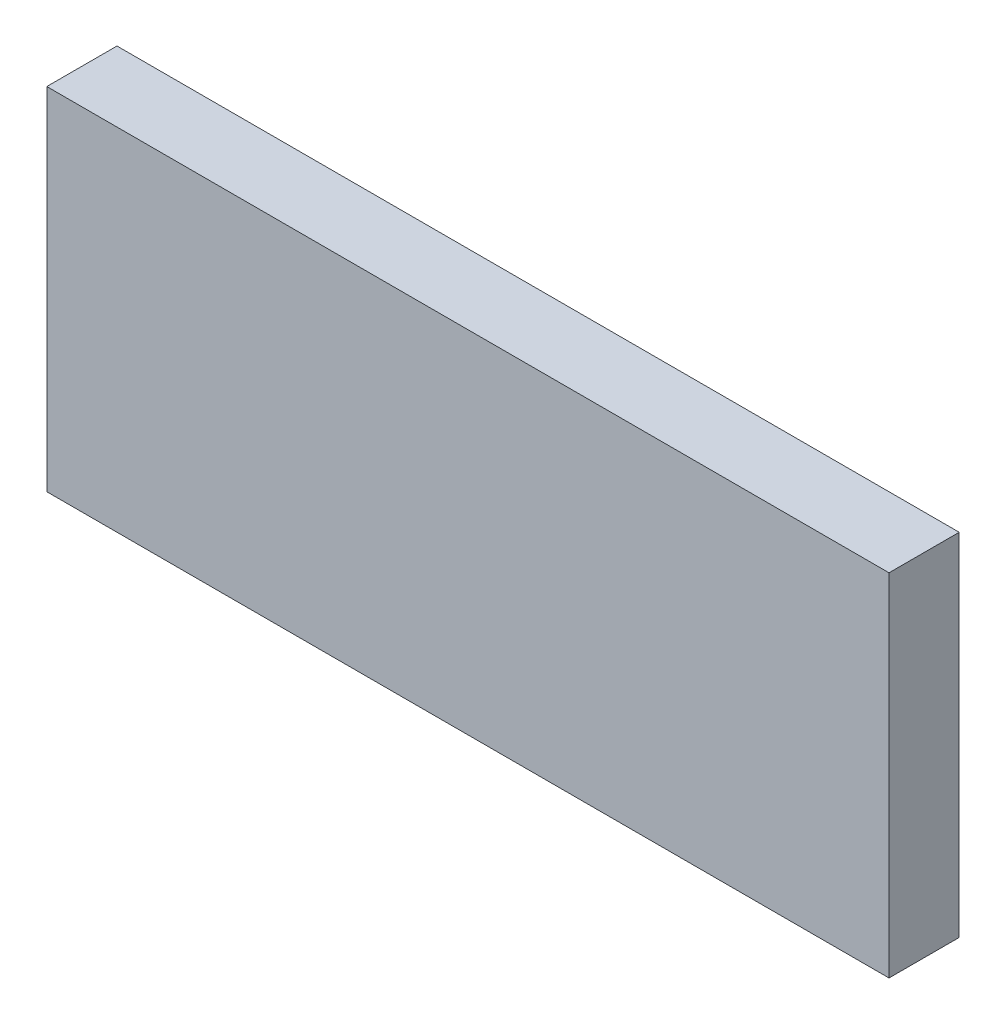
ISO-10303-21;
HEADER;
FILE_DESCRIPTION(('STEP AP214'),'2;1');
FILE_NAME('part.step','',(''),(''),'','','');
FILE_SCHEMA(('AUTOMOTIVE_DESIGN { 1 0 10303 214 1 1 1 1 }'));
ENDSEC;
DATA;
#1=APPLICATION_CONTEXT('core data for automotive mechanical design processes');
#2=APPLICATION_PROTOCOL_DEFINITION('international standard','automotive_design',2000,#1);
#3=PRODUCT_CONTEXT('',#1,'mechanical');
#4=PRODUCT('Part','Part','',(#3));
#5=PRODUCT_RELATED_PRODUCT_CATEGORY('part','',(#4));
#6=PRODUCT_DEFINITION_FORMATION('','',#4);
#7=PRODUCT_DEFINITION_CONTEXT('part definition',#1,'design');
#8=PRODUCT_DEFINITION('design','',#6,#7);
#9=PRODUCT_DEFINITION_SHAPE('','',#8);
#10=(LENGTH_UNIT() NAMED_UNIT(*) SI_UNIT(.MILLI.,.METRE.));
#11=(NAMED_UNIT(*) PLANE_ANGLE_UNIT() SI_UNIT($,.RADIAN.));
#12=(NAMED_UNIT(*) SI_UNIT($,.STERADIAN.) SOLID_ANGLE_UNIT());
#13=UNCERTAINTY_MEASURE_WITH_UNIT(LENGTH_MEASURE(1.E-05),#10,'distance_accuracy_value','');
#14=(GEOMETRIC_REPRESENTATION_CONTEXT(3) GLOBAL_UNCERTAINTY_ASSIGNED_CONTEXT((#13)) GLOBAL_UNIT_ASSIGNED_CONTEXT((#10,
#11,#12)) REPRESENTATION_CONTEXT('',''));
#15=CARTESIAN_POINT('',(0.,0.,0.));
#16=DIRECTION('',(0.,0.,1.));
#17=DIRECTION('',(1.,0.,0.));
#18=AXIS2_PLACEMENT_3D('',#15,#16,#17);
#19=CARTESIAN_POINT('',(1.27500000000002,1.25000000000002,0.));
#20=DIRECTION('',(0.,0.,1.));
#21=DIRECTION('',(1.,0.,0.));
#22=AXIS2_PLACEMENT_3D('',#19,#20,#21);
#23=PLANE('',#22);
#24=DIRECTION('',(1.,0.,0.));
#25=VECTOR('',#24,1.);
#26=CARTESIAN_POINT('',(-3.17433908045977,-1.5,0.));
#27=LINE('',#26,#25);
#28=CARTESIAN_POINT('',(-2.225,-1.5,0.));
#29=VERTEX_POINT('',#28);
#30=CARTESIAN_POINT('',(-1.025,-1.5,0.));
#31=VERTEX_POINT('',#30);
#32=EDGE_CURVE('E20',#29,#31,#27,.T.);
#33=ORIENTED_EDGE('',*,*,#32,.T.);
#34=DIRECTION('',(0.,1.,0.));
#35=VECTOR('',#34,1.);
#36=CARTESIAN_POINT('',(-1.025,-2.2,0.));
#37=LINE('',#36,#35);
#38=CARTESIAN_POINT('',(-1.025,-2.,0.));
#39=VERTEX_POINT('',#38);
#40=EDGE_CURVE('E81',#31,#39,#37,.F.);
#41=ORIENTED_EDGE('',*,*,#40,.T.);
#42=DIRECTION('',(1.,0.,0.));
#43=VECTOR('',#42,1.);
#44=CARTESIAN_POINT('',(-2.225,-2.,0.));
#45=LINE('',#44,#43);
#46=CARTESIAN_POINT('',(-2.225,-2.,0.));
#47=VERTEX_POINT('',#46);
#48=EDGE_CURVE('E55',#47,#39,#45,.T.);
#49=ORIENTED_EDGE('',*,*,#48,.F.);
#50=DIRECTION('',(0.,1.,0.));
#51=VECTOR('',#50,1.);
#52=CARTESIAN_POINT('',(-2.225,2.2,0.));
#53=LINE('',#52,#51);
#54=EDGE_CURVE('E57',#47,#29,#53,.T.);
#55=ORIENTED_EDGE('',*,*,#54,.T.);
#56=EDGE_LOOP('',(#33,#41,#49,#55));
#57=FACE_BOUND('',#56,.T.);
#58=ADVANCED_FACE('F17',(#57),#23,.F.);
#59=CARTESIAN_POINT('',(-3.17433908045977,-1.5,-0.359021698729691));
#60=DIRECTION('',(0.,-1.,0.));
#61=DIRECTION('',(1.,0.,0.));
#62=AXIS2_PLACEMENT_3D('',#59,#60,#61);
#63=PLANE('',#62);
#64=DIRECTION('',(0.,0.,1.));
#65=VECTOR('',#64,1.);
#66=CARTESIAN_POINT('',(-2.225,-1.5,0.1));
#67=LINE('',#66,#65);
#68=CARTESIAN_POINT('',(-2.225,-1.5,0.1));
#69=VERTEX_POINT('',#68);
#70=EDGE_CURVE('E63',#29,#69,#67,.T.);
#71=ORIENTED_EDGE('',*,*,#70,.T.);
#72=DIRECTION('',(1.,0.,0.));
#73=VECTOR('',#72,1.);
#74=CARTESIAN_POINT('',(1.27500000000002,-1.5,0.1));
#75=LINE('',#74,#73);
#76=CARTESIAN_POINT('',(-1.025,-1.5,0.1));
#77=VERTEX_POINT('',#76);
#78=EDGE_CURVE('E83',#77,#69,#75,.F.);
#79=ORIENTED_EDGE('',*,*,#78,.F.);
#80=DIRECTION('',(0.,0.,1.));
#81=VECTOR('',#80,1.);
#82=CARTESIAN_POINT('',(-1.025,-1.5,0.1));
#83=LINE('',#82,#81);
#84=EDGE_CURVE('E68',#77,#31,#83,.F.);
#85=ORIENTED_EDGE('',*,*,#84,.T.);
#86=ORIENTED_EDGE('',*,*,#32,.F.);
#87=EDGE_LOOP('',(#71,#79,#85,#86));
#88=FACE_BOUND('',#87,.T.);
#89=ADVANCED_FACE('F65',(#88),#63,.F.);
#90=CARTESIAN_POINT('',(-2.225,2.2,0.1));
#91=DIRECTION('',(1.,0.,0.));
#92=DIRECTION('',(0.,1.,0.));
#93=AXIS2_PLACEMENT_3D('',#90,#91,#92);
#94=PLANE('',#93);
#95=ORIENTED_EDGE('',*,*,#70,.F.);
#96=ORIENTED_EDGE('',*,*,#54,.F.);
#97=DIRECTION('',(0.,0.,-1.));
#98=VECTOR('',#97,1.);
#99=CARTESIAN_POINT('',(-2.225,-2.,-3.075));
#100=LINE('',#99,#98);
#101=CARTESIAN_POINT('',(-2.225,-2.,0.1));
#102=VERTEX_POINT('',#101);
#103=EDGE_CURVE('E75',#102,#47,#100,.T.);
#104=ORIENTED_EDGE('',*,*,#103,.F.);
#105=DIRECTION('',(0.,1.,0.));
#106=VECTOR('',#105,1.);
#107=CARTESIAN_POINT('',(-2.225,1.25000000000002,0.1));
#108=LINE('',#107,#106);
#109=EDGE_CURVE('E72',#69,#102,#108,.F.);
#110=ORIENTED_EDGE('',*,*,#109,.F.);
#111=EDGE_LOOP('',(#95,#96,#104,#110));
#112=FACE_BOUND('',#111,.T.);
#113=ADVANCED_FACE('F70',(#112),#94,.F.);
#114=CARTESIAN_POINT('',(-2.225,-2.,-3.075));
#115=DIRECTION('',(0.,-1.,0.));
#116=DIRECTION('',(0.,0.,-1.));
#117=AXIS2_PLACEMENT_3D('',#114,#115,#116);
#118=PLANE('',#117);
#119=DIRECTION('',(1.,0.,0.));
#120=VECTOR('',#119,1.);
#121=CARTESIAN_POINT('',(1.27500000000002,-2.,0.1));
#122=LINE('',#121,#120);
#123=CARTESIAN_POINT('',(-1.025,-2.,0.0999999999999999));
#124=VERTEX_POINT('',#123);
#125=EDGE_CURVE('E26',#102,#124,#122,.T.);
#126=ORIENTED_EDGE('',*,*,#125,.F.);
#127=ORIENTED_EDGE('',*,*,#103,.T.);
#128=ORIENTED_EDGE('',*,*,#48,.T.);
#129=DIRECTION('',(0.,0.,1.));
#130=VECTOR('',#129,1.);
#131=CARTESIAN_POINT('',(-1.025,-2.,0.1));
#132=LINE('',#131,#130);
#133=EDGE_CURVE('E35',#39,#124,#132,.T.);
#134=ORIENTED_EDGE('',*,*,#133,.T.);
#135=EDGE_LOOP('',(#126,#127,#128,#134));
#136=FACE_BOUND('',#135,.T.);
#137=ADVANCED_FACE('F89',(#136),#118,.T.);
#138=CARTESIAN_POINT('',(-1.025,-2.2,0.1));
#139=DIRECTION('',(-1.,0.,0.));
#140=DIRECTION('',(0.,0.,1.));
#141=AXIS2_PLACEMENT_3D('',#138,#139,#140);
#142=PLANE('',#141);
#143=ORIENTED_EDGE('',*,*,#84,.F.);
#144=DIRECTION('',(0.,1.,0.));
#145=VECTOR('',#144,1.);
#146=CARTESIAN_POINT('',(-1.025,1.25000000000002,0.1));
#147=LINE('',#146,#145);
#148=EDGE_CURVE('E11',#124,#77,#147,.T.);
#149=ORIENTED_EDGE('',*,*,#148,.F.);
#150=ORIENTED_EDGE('',*,*,#133,.F.);
#151=ORIENTED_EDGE('',*,*,#40,.F.);
#152=EDGE_LOOP('',(#143,#149,#150,#151));
#153=FACE_BOUND('',#152,.T.);
#154=ADVANCED_FACE('F91',(#153),#142,.F.);
#155=CARTESIAN_POINT('',(1.27500000000002,1.25000000000002,0.1));
#156=DIRECTION('',(0.,0.,1.));
#157=DIRECTION('',(1.,0.,0.));
#158=AXIS2_PLACEMENT_3D('',#155,#156,#157);
#159=PLANE('',#158);
#160=ORIENTED_EDGE('',*,*,#125,.T.);
#161=ORIENTED_EDGE('',*,*,#148,.T.);
#162=ORIENTED_EDGE('',*,*,#78,.T.);
#163=ORIENTED_EDGE('',*,*,#109,.T.);
#164=EDGE_LOOP('',(#160,#161,#162,#163));
#165=FACE_BOUND('',#164,.T.);
#166=ADVANCED_FACE('F88',(#165),#159,.T.);
#167=CLOSED_SHELL('',(#58,#89,#113,#137,#154,#166));
#168=MANIFOLD_SOLID_BREP('B1',#167);
#169=ADVANCED_BREP_SHAPE_REPRESENTATION('',(#18,#168),#14);
#170=SHAPE_DEFINITION_REPRESENTATION(#9,#169);
ENDSEC;
END-ISO-10303-21;
